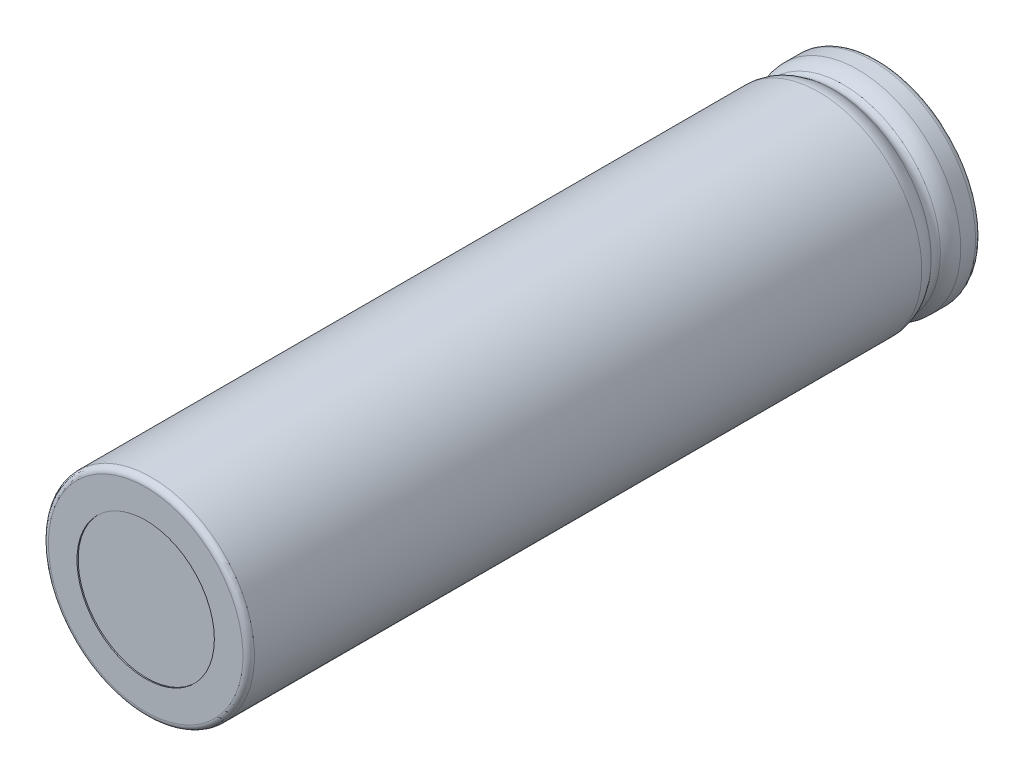
ISO-10303-21;
HEADER;
FILE_DESCRIPTION(('STEP AP214'),'2;1');
FILE_NAME('part.step','',(''),(''),'','','');
FILE_SCHEMA(('AUTOMOTIVE_DESIGN { 1 0 10303 214 1 1 1 1 }'));
ENDSEC;
DATA;
#1=APPLICATION_CONTEXT('core data for automotive mechanical design processes');
#2=APPLICATION_PROTOCOL_DEFINITION('international standard','automotive_design',2000,#1);
#3=PRODUCT_CONTEXT('',#1,'mechanical');
#4=PRODUCT('Part','Part','',(#3));
#5=PRODUCT_RELATED_PRODUCT_CATEGORY('part','',(#4));
#6=PRODUCT_DEFINITION_FORMATION('','',#4);
#7=PRODUCT_DEFINITION_CONTEXT('part definition',#1,'design');
#8=PRODUCT_DEFINITION('design','',#6,#7);
#9=PRODUCT_DEFINITION_SHAPE('','',#8);
#10=(LENGTH_UNIT() NAMED_UNIT(*) SI_UNIT(.MILLI.,.METRE.));
#11=(NAMED_UNIT(*) PLANE_ANGLE_UNIT() SI_UNIT($,.RADIAN.));
#12=(NAMED_UNIT(*) SI_UNIT($,.STERADIAN.) SOLID_ANGLE_UNIT());
#13=UNCERTAINTY_MEASURE_WITH_UNIT(LENGTH_MEASURE(1.E-05),#10,'distance_accuracy_value','');
#14=(GEOMETRIC_REPRESENTATION_CONTEXT(3) GLOBAL_UNCERTAINTY_ASSIGNED_CONTEXT((#13)) GLOBAL_UNIT_ASSIGNED_CONTEXT((#10,
#11,#12)) REPRESENTATION_CONTEXT('',''));
#15=CARTESIAN_POINT('',(0.,0.,0.));
#16=DIRECTION('',(0.,0.,1.));
#17=DIRECTION('',(1.,0.,0.));
#18=AXIS2_PLACEMENT_3D('',#15,#16,#17);
#19=CARTESIAN_POINT('',(0.,9.,-64.));
#20=DIRECTION('',(0.,0.,1.));
#21=DIRECTION('',(1.,0.,0.));
#22=AXIS2_PLACEMENT_3D('',#19,#20,#21);
#23=PLANE('',#22);
#24=CARTESIAN_POINT('',(0.,0.,-64.));
#25=DIRECTION('',(0.,0.,-1.));
#26=DIRECTION('',(-1.,0.,0.));
#27=AXIS2_PLACEMENT_3D('',#24,#25,#26);
#28=CIRCLE('',#27,7.5);
#29=CARTESIAN_POINT('',(-7.5,0.,-64.));
#30=VERTEX_POINT('',#29);
#31=EDGE_CURVE('E81',#30,#30,#28,.T.);
#32=ORIENTED_EDGE('',*,*,#31,.F.);
#33=EDGE_LOOP('',(#32));
#34=FACE_BOUND('',#33,.T.);
#35=CARTESIAN_POINT('',(0.,0.,-64.));
#36=DIRECTION('',(0.,0.,1.));
#37=DIRECTION('',(1.,0.,0.));
#38=AXIS2_PLACEMENT_3D('',#35,#36,#37);
#39=CIRCLE('',#38,8.5);
#40=CARTESIAN_POINT('',(8.5,0.,-64.));
#41=VERTEX_POINT('',#40);
#42=EDGE_CURVE('E59',#41,#41,#39,.F.);
#43=ORIENTED_EDGE('',*,*,#42,.T.);
#44=EDGE_LOOP('',(#43));
#45=FACE_BOUND('',#44,.T.);
#46=ADVANCED_FACE('F33',(#34,#45),#23,.F.);
#47=CARTESIAN_POINT('',(0.,0.,1000.));
#48=DIRECTION('',(0.,0.,1.));
#49=DIRECTION('',(1.,0.,0.));
#50=AXIS2_PLACEMENT_3D('',#47,#48,#49);
#51=CYLINDRICAL_SURFACE('',#50,9.);
#52=CARTESIAN_POINT('',(0.,0.,-62.2001838135919));
#53=DIRECTION('',(0.,0.,-1.));
#54=DIRECTION('',(-1.,0.,0.));
#55=AXIS2_PLACEMENT_3D('',#52,#53,#54);
#56=CIRCLE('',#55,9.);
#57=CARTESIAN_POINT('',(-9.,0.,-62.2001838135919));
#58=VERTEX_POINT('',#57);
#59=EDGE_CURVE('E48',#58,#58,#56,.T.);
#60=ORIENTED_EDGE('',*,*,#59,.T.);
#61=EDGE_LOOP('',(#60));
#62=FACE_BOUND('',#61,.T.);
#63=CARTESIAN_POINT('',(0.,0.,-63.4999999999999));
#64=DIRECTION('',(0.,0.,1.));
#65=DIRECTION('',(1.,0.,0.));
#66=AXIS2_PLACEMENT_3D('',#63,#64,#65);
#67=CIRCLE('',#66,9.);
#68=CARTESIAN_POINT('',(9.,0.,-63.4999999999999));
#69=VERTEX_POINT('',#68);
#70=EDGE_CURVE('E62',#69,#69,#67,.T.);
#71=ORIENTED_EDGE('',*,*,#70,.T.);
#72=EDGE_LOOP('',(#71));
#73=FACE_BOUND('',#72,.T.);
#74=ADVANCED_FACE('F111',(#62,#73),#51,.T.);
#75=CARTESIAN_POINT('',(0.,0.,-60.5));
#76=DIRECTION('',(0.,0.,1.));
#77=DIRECTION('',(1.,0.,0.));
#78=AXIS2_PLACEMENT_3D('',#75,#76,#77);
#79=TOROIDAL_SURFACE('',#78,9.,0.625000000000001);
#80=CARTESIAN_POINT('',(0.,0.,-60.9048056699028));
#81=DIRECTION('',(0.,0.,1.));
#82=DIRECTION('',(1.,0.,0.));
#83=AXIS2_PLACEMENT_3D('',#80,#81,#82);
#84=CIRCLE('',#83,8.52380952380955);
#85=CARTESIAN_POINT('',(8.52380952380955,0.,-60.9048056699028));
#86=VERTEX_POINT('',#85);
#87=EDGE_CURVE('E53',#86,#86,#84,.T.);
#88=ORIENTED_EDGE('',*,*,#87,.T.);
#89=EDGE_LOOP('',(#88));
#90=FACE_BOUND('',#89,.T.);
#91=CARTESIAN_POINT('',(0.,0.,-60.0951943300972));
#92=DIRECTION('',(0.,0.,-1.));
#93=DIRECTION('',(-1.,0.,0.));
#94=AXIS2_PLACEMENT_3D('',#91,#92,#93);
#95=CIRCLE('',#94,8.52380952380955);
#96=CARTESIAN_POINT('',(-8.52380952380955,0.,-60.0951943300972));
#97=VERTEX_POINT('',#96);
#98=EDGE_CURVE('E56',#97,#97,#95,.T.);
#99=ORIENTED_EDGE('',*,*,#98,.T.);
#100=EDGE_LOOP('',(#99));
#101=FACE_BOUND('',#100,.T.);
#102=ADVANCED_FACE('F125',(#90,#101),#79,.F.);
#103=CARTESIAN_POINT('',(0.,0.,1000.));
#104=DIRECTION('',(0.,0.,1.));
#105=DIRECTION('',(1.,0.,0.));
#106=AXIS2_PLACEMENT_3D('',#103,#104,#105);
#107=CYLINDRICAL_SURFACE('',#106,9.);
#108=CARTESIAN_POINT('',(0.,0.,-58.7998161864081));
#109=DIRECTION('',(0.,0.,-1.));
#110=DIRECTION('',(-1.,0.,0.));
#111=AXIS2_PLACEMENT_3D('',#108,#109,#110);
#112=CIRCLE('',#111,9.);
#113=CARTESIAN_POINT('',(-9.,0.,-58.7998161864081));
#114=VERTEX_POINT('',#113);
#115=EDGE_CURVE('E44',#114,#114,#112,.F.);
#116=ORIENTED_EDGE('',*,*,#115,.T.);
#117=EDGE_LOOP('',(#116));
#118=FACE_BOUND('',#117,.T.);
#119=CARTESIAN_POINT('',(0.,0.,-0.499999999999945));
#120=DIRECTION('',(0.,0.,-1.));
#121=DIRECTION('',(-1.,0.,0.));
#122=AXIS2_PLACEMENT_3D('',#119,#120,#121);
#123=CIRCLE('',#122,9.);
#124=CARTESIAN_POINT('',(-9.,0.,-0.499999999999945));
#125=VERTEX_POINT('',#124);
#126=EDGE_CURVE('E65',#125,#125,#123,.T.);
#127=ORIENTED_EDGE('',*,*,#126,.T.);
#128=EDGE_LOOP('',(#127));
#129=FACE_BOUND('',#128,.T.);
#130=ADVANCED_FACE('F131',(#118,#129),#107,.T.);
#131=CARTESIAN_POINT('',(0.,0.,0.));
#132=DIRECTION('',(0.,0.,-1.));
#133=DIRECTION('',(-1.,0.,0.));
#134=AXIS2_PLACEMENT_3D('',#131,#132,#133);
#135=PLANE('',#134);
#136=CARTESIAN_POINT('',(0.,0.,0.));
#137=DIRECTION('',(0.,0.,1.));
#138=DIRECTION('',(1.,0.,0.));
#139=AXIS2_PLACEMENT_3D('',#136,#137,#138);
#140=CIRCLE('',#139,6.);
#141=CARTESIAN_POINT('',(6.,0.,0.));
#142=VERTEX_POINT('',#141);
#143=EDGE_CURVE('E75',#142,#142,#140,.T.);
#144=ORIENTED_EDGE('',*,*,#143,.F.);
#145=EDGE_LOOP('',(#144));
#146=FACE_BOUND('',#145,.T.);
#147=CARTESIAN_POINT('',(0.,0.,0.));
#148=DIRECTION('',(0.,0.,-1.));
#149=DIRECTION('',(-1.,0.,0.));
#150=AXIS2_PLACEMENT_3D('',#147,#148,#149);
#151=CIRCLE('',#150,8.5);
#152=CARTESIAN_POINT('',(-8.5,0.,0.));
#153=VERTEX_POINT('',#152);
#154=EDGE_CURVE('E68',#153,#153,#151,.F.);
#155=ORIENTED_EDGE('',*,*,#154,.T.);
#156=EDGE_LOOP('',(#155));
#157=FACE_BOUND('',#156,.T.);
#158=ADVANCED_FACE('F143',(#146,#157),#135,.F.);
#159=CARTESIAN_POINT('',(0.,0.,-0.499999999999945));
#160=DIRECTION('',(0.,0.,-1.));
#161=DIRECTION('',(-1.,0.,0.));
#162=AXIS2_PLACEMENT_3D('',#159,#160,#161);
#163=TOROIDAL_SURFACE('',#162,8.5,0.5);
#164=ORIENTED_EDGE('',*,*,#126,.F.);
#165=EDGE_LOOP('',(#164));
#166=FACE_BOUND('',#165,.T.);
#167=ORIENTED_EDGE('',*,*,#154,.F.);
#168=EDGE_LOOP('',(#167));
#169=FACE_BOUND('',#168,.T.);
#170=ADVANCED_FACE('F120',(#166,#169),#163,.T.);
#171=CARTESIAN_POINT('',(0.,0.,-63.4999999999999));
#172=DIRECTION('',(0.,0.,1.));
#173=DIRECTION('',(1.,0.,0.));
#174=AXIS2_PLACEMENT_3D('',#171,#172,#173);
#175=TOROIDAL_SURFACE('',#174,8.5,0.5);
#176=ORIENTED_EDGE('',*,*,#42,.F.);
#177=EDGE_LOOP('',(#176));
#178=FACE_BOUND('',#177,.T.);
#179=ORIENTED_EDGE('',*,*,#70,.F.);
#180=EDGE_LOOP('',(#179));
#181=FACE_BOUND('',#180,.T.);
#182=ADVANCED_FACE('F116',(#178,#181),#175,.T.);
#183=CARTESIAN_POINT('',(0.,0.,-62.2001838135919));
#184=DIRECTION('',(0.,0.,-1.));
#185=DIRECTION('',(-1.,0.,0.));
#186=AXIS2_PLACEMENT_3D('',#183,#184,#185);
#187=TOROIDAL_SURFACE('',#186,7.,2.);
#188=ORIENTED_EDGE('',*,*,#59,.F.);
#189=EDGE_LOOP('',(#188));
#190=FACE_BOUND('',#189,.T.);
#191=ORIENTED_EDGE('',*,*,#87,.F.);
#192=EDGE_LOOP('',(#191));
#193=FACE_BOUND('',#192,.T.);
#194=ADVANCED_FACE('F119',(#190,#193),#187,.T.);
#195=CARTESIAN_POINT('',(0.,0.,-58.7998161864081));
#196=DIRECTION('',(0.,0.,-1.));
#197=DIRECTION('',(-1.,0.,0.));
#198=AXIS2_PLACEMENT_3D('',#195,#196,#197);
#199=TOROIDAL_SURFACE('',#198,7.,2.);
#200=ORIENTED_EDGE('',*,*,#98,.F.);
#201=EDGE_LOOP('',(#200));
#202=FACE_BOUND('',#201,.T.);
#203=ORIENTED_EDGE('',*,*,#115,.F.);
#204=EDGE_LOOP('',(#203));
#205=FACE_BOUND('',#204,.T.);
#206=ADVANCED_FACE('F147',(#202,#205),#199,.T.);
#207=CARTESIAN_POINT('',(0.,0.,-0.1));
#208=DIRECTION('',(0.,0.,1.));
#209=DIRECTION('',(1.,0.,0.));
#210=AXIS2_PLACEMENT_3D('',#207,#208,#209);
#211=CYLINDRICAL_SURFACE('',#210,6.);
#212=CARTESIAN_POINT('',(0.,0.,-0.1));
#213=DIRECTION('',(0.,0.,1.));
#214=DIRECTION('',(1.,0.,0.));
#215=AXIS2_PLACEMENT_3D('',#212,#213,#214);
#216=CIRCLE('',#215,6.);
#217=CARTESIAN_POINT('',(6.,0.,-0.1));
#218=VERTEX_POINT('',#217);
#219=EDGE_CURVE('E74',#218,#218,#216,.T.);
#220=ORIENTED_EDGE('',*,*,#219,.F.);
#221=EDGE_LOOP('',(#220));
#222=FACE_BOUND('',#221,.T.);
#223=ORIENTED_EDGE('',*,*,#143,.T.);
#224=EDGE_LOOP('',(#223));
#225=FACE_BOUND('',#224,.T.);
#226=ADVANCED_FACE('F150',(#222,#225),#211,.F.);
#227=CARTESIAN_POINT('',(0.,0.,-0.1));
#228=DIRECTION('',(0.,0.,1.));
#229=DIRECTION('',(1.,0.,0.));
#230=AXIS2_PLACEMENT_3D('',#227,#228,#229);
#231=PLANE('',#230);
#232=ORIENTED_EDGE('',*,*,#219,.T.);
#233=EDGE_LOOP('',(#232));
#234=FACE_BOUND('',#233,.T.);
#235=ADVANCED_FACE('F105',(#234),#231,.T.);
#236=CARTESIAN_POINT('',(0.,0.,-63.9));
#237=DIRECTION('',(0.,0.,-1.));
#238=DIRECTION('',(-1.,0.,0.));
#239=AXIS2_PLACEMENT_3D('',#236,#237,#238);
#240=CYLINDRICAL_SURFACE('',#239,7.5);
#241=CARTESIAN_POINT('',(0.,0.,-63.9));
#242=DIRECTION('',(0.,0.,-1.));
#243=DIRECTION('',(-1.,0.,0.));
#244=AXIS2_PLACEMENT_3D('',#241,#242,#243);
#245=CIRCLE('',#244,7.5);
#246=CARTESIAN_POINT('',(-7.5,0.,-63.9));
#247=VERTEX_POINT('',#246);
#248=EDGE_CURVE('E78',#247,#247,#245,.T.);
#249=ORIENTED_EDGE('',*,*,#248,.F.);
#250=EDGE_LOOP('',(#249));
#251=FACE_BOUND('',#250,.T.);
#252=ORIENTED_EDGE('',*,*,#31,.T.);
#253=EDGE_LOOP('',(#252));
#254=FACE_BOUND('',#253,.T.);
#255=ADVANCED_FACE('F99',(#251,#254),#240,.F.);
#256=CARTESIAN_POINT('',(0.,0.,-63.9));
#257=DIRECTION('',(0.,0.,-1.));
#258=DIRECTION('',(-1.,0.,0.));
#259=AXIS2_PLACEMENT_3D('',#256,#257,#258);
#260=PLANE('',#259);
#261=CARTESIAN_POINT('',(0.,0.,-63.9));
#262=DIRECTION('',(0.,0.,-1.));
#263=DIRECTION('',(-1.,0.,0.));
#264=AXIS2_PLACEMENT_3D('',#261,#262,#263);
#265=CIRCLE('',#264,3.1);
#266=CARTESIAN_POINT('',(-3.1,0.,-63.9));
#267=VERTEX_POINT('',#266);
#268=EDGE_CURVE('E84',#267,#267,#265,.T.);
#269=ORIENTED_EDGE('',*,*,#268,.F.);
#270=EDGE_LOOP('',(#269));
#271=FACE_BOUND('',#270,.T.);
#272=ORIENTED_EDGE('',*,*,#248,.T.);
#273=EDGE_LOOP('',(#272));
#274=FACE_BOUND('',#273,.T.);
#275=ADVANCED_FACE('F96',(#271,#274),#260,.T.);
#276=CARTESIAN_POINT('',(0.,0.,-63.9));
#277=DIRECTION('',(0.,0.,-1.));
#278=DIRECTION('',(-1.,0.,0.));
#279=AXIS2_PLACEMENT_3D('',#276,#277,#278);
#280=CYLINDRICAL_SURFACE('',#279,3.1);
#281=ORIENTED_EDGE('',*,*,#268,.T.);
#282=EDGE_LOOP('',(#281));
#283=FACE_BOUND('',#282,.T.);
#284=CARTESIAN_POINT('',(0.,0.,-64.));
#285=DIRECTION('',(0.,0.,-1.));
#286=DIRECTION('',(-1.,0.,0.));
#287=AXIS2_PLACEMENT_3D('',#284,#285,#286);
#288=CIRCLE('',#287,3.1);
#289=CARTESIAN_POINT('',(-3.1,0.,-64.));
#290=VERTEX_POINT('',#289);
#291=EDGE_CURVE('E87',#290,#290,#288,.T.);
#292=ORIENTED_EDGE('',*,*,#291,.F.);
#293=EDGE_LOOP('',(#292));
#294=FACE_BOUND('',#293,.T.);
#295=ADVANCED_FACE('F93',(#283,#294),#280,.T.);
#296=CARTESIAN_POINT('',(0.,3.075,-65.));
#297=DIRECTION('',(0.,0.,1.));
#298=DIRECTION('',(1.,0.,0.));
#299=AXIS2_PLACEMENT_3D('',#296,#297,#298);
#300=PLANE('',#299);
#301=CARTESIAN_POINT('',(0.,0.,-65.));
#302=DIRECTION('',(0.,0.,1.));
#303=DIRECTION('',(1.,0.,0.));
#304=AXIS2_PLACEMENT_3D('',#301,#302,#303);
#305=CIRCLE('',#304,2.875);
#306=CARTESIAN_POINT('',(2.875,0.,-65.));
#307=VERTEX_POINT('',#306);
#308=EDGE_CURVE('E10',#307,#307,#305,.F.);
#309=ORIENTED_EDGE('',*,*,#308,.T.);
#310=EDGE_LOOP('',(#309));
#311=FACE_BOUND('',#310,.T.);
#312=ADVANCED_FACE('F139',(#311),#300,.F.);
#313=CARTESIAN_POINT('',(0.,0.,-64.8));
#314=DIRECTION('',(0.,0.,1.));
#315=DIRECTION('',(1.,0.,0.));
#316=AXIS2_PLACEMENT_3D('',#313,#314,#315);
#317=TOROIDAL_SURFACE('',#316,2.875,0.2);
#318=ORIENTED_EDGE('',*,*,#308,.F.);
#319=EDGE_LOOP('',(#318));
#320=FACE_BOUND('',#319,.T.);
#321=CARTESIAN_POINT('',(0.,0.,-64.8));
#322=DIRECTION('',(0.,0.,1.));
#323=DIRECTION('',(1.,0.,0.));
#324=AXIS2_PLACEMENT_3D('',#321,#322,#323);
#325=CIRCLE('',#324,3.075);
#326=CARTESIAN_POINT('',(3.075,0.,-64.8));
#327=VERTEX_POINT('',#326);
#328=EDGE_CURVE('E40',#327,#327,#325,.T.);
#329=ORIENTED_EDGE('',*,*,#328,.F.);
#330=EDGE_LOOP('',(#329));
#331=FACE_BOUND('',#330,.T.);
#332=ADVANCED_FACE('F35',(#320,#331),#317,.T.);
#333=CARTESIAN_POINT('',(0.,0.,1000.));
#334=DIRECTION('',(0.,0.,1.));
#335=DIRECTION('',(1.,0.,0.));
#336=AXIS2_PLACEMENT_3D('',#333,#334,#335);
#337=CYLINDRICAL_SURFACE('',#336,3.075);
#338=ORIENTED_EDGE('',*,*,#328,.T.);
#339=EDGE_LOOP('',(#338));
#340=FACE_BOUND('',#339,.T.);
#341=CARTESIAN_POINT('',(0.,0.,-64.0000000000001));
#342=DIRECTION('',(0.,0.,1.));
#343=DIRECTION('',(1.,0.,0.));
#344=AXIS2_PLACEMENT_3D('',#341,#342,#343);
#345=CIRCLE('',#344,3.075);
#346=CARTESIAN_POINT('',(3.075,0.,-64.0000000000001));
#347=VERTEX_POINT('',#346);
#348=EDGE_CURVE('E71',#347,#347,#345,.T.);
#349=ORIENTED_EDGE('',*,*,#348,.F.);
#350=EDGE_LOOP('',(#349));
#351=FACE_BOUND('',#350,.T.);
#352=ADVANCED_FACE('F136',(#340,#351),#337,.T.);
#353=ORIENTED_EDGE('',*,*,#348,.T.);
#354=EDGE_LOOP('',(#353));
#355=FACE_BOUND('',#354,.T.);
#356=ORIENTED_EDGE('',*,*,#291,.T.);
#357=EDGE_LOOP('',(#356));
#358=FACE_BOUND('',#357,.T.);
#359=ADVANCED_FACE('F113',(#355,#358),#23,.F.);
#360=CLOSED_SHELL('',(#46,#74,#102,#130,#158,#170,#182,#194,#206,#226,#235,#255,#275,#295,#312,
#332,#352,#359));
#361=MANIFOLD_SOLID_BREP('B2',#360);
#362=ADVANCED_BREP_SHAPE_REPRESENTATION('',(#18,#361),#14);
#363=SHAPE_DEFINITION_REPRESENTATION(#9,#362);
ENDSEC;
END-ISO-10303-21;
